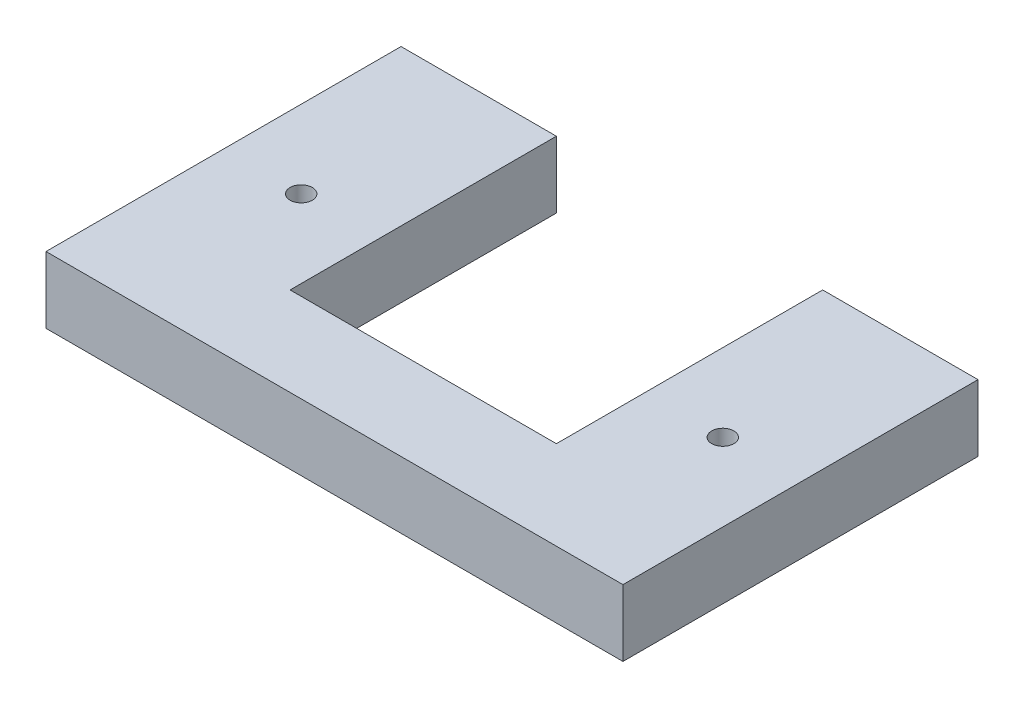
ISO-10303-21;
HEADER;
FILE_DESCRIPTION(('STEP AP214'),'2;1');
FILE_NAME('part.step','',(''),(''),'','','');
FILE_SCHEMA(('AUTOMOTIVE_DESIGN { 1 0 10303 214 1 1 1 1 }'));
ENDSEC;
DATA;
#1=APPLICATION_CONTEXT('core data for automotive mechanical design processes');
#2=APPLICATION_PROTOCOL_DEFINITION('international standard','automotive_design',2000,#1);
#3=PRODUCT_CONTEXT('',#1,'mechanical');
#4=PRODUCT('Part','Part','',(#3));
#5=PRODUCT_RELATED_PRODUCT_CATEGORY('part','',(#4));
#6=PRODUCT_DEFINITION_FORMATION('','',#4);
#7=PRODUCT_DEFINITION_CONTEXT('part definition',#1,'design');
#8=PRODUCT_DEFINITION('design','',#6,#7);
#9=PRODUCT_DEFINITION_SHAPE('','',#8);
#10=(LENGTH_UNIT() NAMED_UNIT(*) SI_UNIT(.MILLI.,.METRE.));
#11=(NAMED_UNIT(*) PLANE_ANGLE_UNIT() SI_UNIT($,.RADIAN.));
#12=(NAMED_UNIT(*) SI_UNIT($,.STERADIAN.) SOLID_ANGLE_UNIT());
#13=UNCERTAINTY_MEASURE_WITH_UNIT(LENGTH_MEASURE(1.E-05),#10,'distance_accuracy_value','');
#14=(GEOMETRIC_REPRESENTATION_CONTEXT(3) GLOBAL_UNCERTAINTY_ASSIGNED_CONTEXT((#13)) GLOBAL_UNIT_ASSIGNED_CONTEXT((#10,
#11,#12)) REPRESENTATION_CONTEXT('',''));
#15=CARTESIAN_POINT('',(0.,0.,0.));
#16=DIRECTION('',(0.,0.,1.));
#17=DIRECTION('',(1.,0.,0.));
#18=AXIS2_PLACEMENT_3D('',#15,#16,#17);
#19=CARTESIAN_POINT('',(-82.55,19.05,-50.8));
#20=DIRECTION('',(0.,0.,1.));
#21=DIRECTION('',(1.,0.,0.));
#22=AXIS2_PLACEMENT_3D('',#19,#20,#21);
#23=PLANE('',#22);
#24=DIRECTION('',(-1.,0.,0.));
#25=VECTOR('',#24,1.);
#26=CARTESIAN_POINT('',(-82.55,19.05,-50.8));
#27=LINE('',#26,#25);
#28=CARTESIAN_POINT('',(-38.1,19.05,-50.8));
#29=VERTEX_POINT('',#28);
#30=CARTESIAN_POINT('',(-82.55,19.05,-50.8));
#31=VERTEX_POINT('',#30);
#32=EDGE_CURVE('E167',#29,#31,#27,.T.);
#33=ORIENTED_EDGE('',*,*,#32,.F.);
#34=DIRECTION('',(0.,1.,0.));
#35=VECTOR('',#34,1.);
#36=CARTESIAN_POINT('',(-38.1,0.,-50.8));
#37=LINE('',#36,#35);
#38=CARTESIAN_POINT('',(-38.1,0.,-50.8));
#39=VERTEX_POINT('',#38);
#40=EDGE_CURVE('E155',#39,#29,#37,.T.);
#41=ORIENTED_EDGE('',*,*,#40,.F.);
#42=DIRECTION('',(-1.,0.,0.));
#43=VECTOR('',#42,1.);
#44=CARTESIAN_POINT('',(-82.55,0.,-50.8));
#45=LINE('',#44,#43);
#46=CARTESIAN_POINT('',(-82.55,0.,-50.8));
#47=VERTEX_POINT('',#46);
#48=EDGE_CURVE('E137',#39,#47,#45,.T.);
#49=ORIENTED_EDGE('',*,*,#48,.T.);
#50=DIRECTION('',(0.,-1.,0.));
#51=VECTOR('',#50,1.);
#52=CARTESIAN_POINT('',(-82.55,19.05,-50.8));
#53=LINE('',#52,#51);
#54=EDGE_CURVE('E48',#31,#47,#53,.T.);
#55=ORIENTED_EDGE('',*,*,#54,.F.);
#56=EDGE_LOOP('',(#33,#41,#49,#55));
#57=FACE_BOUND('',#56,.T.);
#58=ADVANCED_FACE('F39',(#57),#23,.F.);
#59=CARTESIAN_POINT('',(82.55,19.05,50.8));
#60=DIRECTION('',(-1.,0.,0.));
#61=DIRECTION('',(0.,0.,1.));
#62=AXIS2_PLACEMENT_3D('',#59,#60,#61);
#63=PLANE('',#62);
#64=DIRECTION('',(0.,0.,-1.));
#65=VECTOR('',#64,1.);
#66=CARTESIAN_POINT('',(82.55,0.,50.8));
#67=LINE('',#66,#65);
#68=CARTESIAN_POINT('',(82.55,0.,50.8));
#69=VERTEX_POINT('',#68);
#70=CARTESIAN_POINT('',(82.55,0.,-50.8));
#71=VERTEX_POINT('',#70);
#72=EDGE_CURVE('E158',#69,#71,#67,.T.);
#73=ORIENTED_EDGE('',*,*,#72,.T.);
#74=DIRECTION('',(0.,-1.,0.));
#75=VECTOR('',#74,1.);
#76=CARTESIAN_POINT('',(82.55,19.05,-50.8));
#77=LINE('',#76,#75);
#78=CARTESIAN_POINT('',(82.55,19.05,-50.8));
#79=VERTEX_POINT('',#78);
#80=EDGE_CURVE('E11',#79,#71,#77,.T.);
#81=ORIENTED_EDGE('',*,*,#80,.F.);
#82=DIRECTION('',(0.,0.,-1.));
#83=VECTOR('',#82,1.);
#84=CARTESIAN_POINT('',(82.55,19.05,50.8));
#85=LINE('',#84,#83);
#86=CARTESIAN_POINT('',(82.55,19.05,50.8));
#87=VERTEX_POINT('',#86);
#88=EDGE_CURVE('E164',#87,#79,#85,.T.);
#89=ORIENTED_EDGE('',*,*,#88,.F.);
#90=DIRECTION('',(0.,-1.,0.));
#91=VECTOR('',#90,1.);
#92=CARTESIAN_POINT('',(82.55,19.05,50.8));
#93=LINE('',#92,#91);
#94=EDGE_CURVE('E175',#87,#69,#93,.T.);
#95=ORIENTED_EDGE('',*,*,#94,.T.);
#96=EDGE_LOOP('',(#73,#81,#89,#95));
#97=FACE_BOUND('',#96,.T.);
#98=ADVANCED_FACE('F41',(#97),#63,.F.);
#99=CARTESIAN_POINT('',(38.1,0.,-50.8));
#100=VERTEX_POINT('',#99);
#101=EDGE_CURVE('E179',#71,#100,#45,.T.);
#102=ORIENTED_EDGE('',*,*,#101,.T.);
#103=DIRECTION('',(0.,1.,0.));
#104=VECTOR('',#103,1.);
#105=CARTESIAN_POINT('',(38.1,0.,-50.8));
#106=LINE('',#105,#104);
#107=CARTESIAN_POINT('',(38.1,19.05,-50.8));
#108=VERTEX_POINT('',#107);
#109=EDGE_CURVE('E159',#100,#108,#106,.T.);
#110=ORIENTED_EDGE('',*,*,#109,.T.);
#111=EDGE_CURVE('E92',#79,#108,#27,.T.);
#112=ORIENTED_EDGE('',*,*,#111,.F.);
#113=ORIENTED_EDGE('',*,*,#80,.T.);
#114=EDGE_LOOP('',(#102,#110,#112,#113));
#115=FACE_BOUND('',#114,.T.);
#116=ADVANCED_FACE('F215',(#115),#23,.F.);
#117=CARTESIAN_POINT('',(-82.55,19.05,50.8));
#118=DIRECTION('',(1.,0.,0.));
#119=DIRECTION('',(0.,0.,-1.));
#120=AXIS2_PLACEMENT_3D('',#117,#118,#119);
#121=PLANE('',#120);
#122=DIRECTION('',(0.,0.,1.));
#123=VECTOR('',#122,1.);
#124=CARTESIAN_POINT('',(-82.55,0.,50.8));
#125=LINE('',#124,#123);
#126=CARTESIAN_POINT('',(-82.55,0.,50.8));
#127=VERTEX_POINT('',#126);
#128=EDGE_CURVE('E183',#47,#127,#125,.T.);
#129=ORIENTED_EDGE('',*,*,#128,.T.);
#130=DIRECTION('',(0.,-1.,0.));
#131=VECTOR('',#130,1.);
#132=CARTESIAN_POINT('',(-82.55,19.05,50.8));
#133=LINE('',#132,#131);
#134=CARTESIAN_POINT('',(-82.55,19.05,50.8));
#135=VERTEX_POINT('',#134);
#136=EDGE_CURVE('E190',#135,#127,#133,.T.);
#137=ORIENTED_EDGE('',*,*,#136,.F.);
#138=DIRECTION('',(0.,0.,1.));
#139=VECTOR('',#138,1.);
#140=CARTESIAN_POINT('',(-82.55,19.05,50.8));
#141=LINE('',#140,#139);
#142=EDGE_CURVE('E170',#31,#135,#141,.T.);
#143=ORIENTED_EDGE('',*,*,#142,.F.);
#144=ORIENTED_EDGE('',*,*,#54,.T.);
#145=EDGE_LOOP('',(#129,#137,#143,#144));
#146=FACE_BOUND('',#145,.T.);
#147=ADVANCED_FACE('F197',(#146),#121,.F.);
#148=CARTESIAN_POINT('',(-82.55,19.05,50.8));
#149=DIRECTION('',(0.,0.,-1.));
#150=DIRECTION('',(-1.,0.,0.));
#151=AXIS2_PLACEMENT_3D('',#148,#149,#150);
#152=PLANE('',#151);
#153=DIRECTION('',(1.,0.,0.));
#154=VECTOR('',#153,1.);
#155=CARTESIAN_POINT('',(-82.55,0.,50.8));
#156=LINE('',#155,#154);
#157=EDGE_CURVE('E85',#127,#69,#156,.T.);
#158=ORIENTED_EDGE('',*,*,#157,.T.);
#159=ORIENTED_EDGE('',*,*,#94,.F.);
#160=DIRECTION('',(1.,0.,0.));
#161=VECTOR('',#160,1.);
#162=CARTESIAN_POINT('',(-82.55,19.05,50.8));
#163=LINE('',#162,#161);
#164=EDGE_CURVE('E64',#135,#87,#163,.T.);
#165=ORIENTED_EDGE('',*,*,#164,.F.);
#166=ORIENTED_EDGE('',*,*,#136,.T.);
#167=EDGE_LOOP('',(#158,#159,#165,#166));
#168=FACE_BOUND('',#167,.T.);
#169=ADVANCED_FACE('F205',(#168),#152,.F.);
#170=CARTESIAN_POINT('',(0.,19.05,0.));
#171=DIRECTION('',(0.,-1.,0.));
#172=DIRECTION('',(0.,0.,-1.));
#173=AXIS2_PLACEMENT_3D('',#170,#171,#172);
#174=PLANE('',#173);
#175=CARTESIAN_POINT('',(-60.325,19.05,0.));
#176=DIRECTION('',(0.,1.,0.));
#177=DIRECTION('',(0.,0.,1.));
#178=AXIS2_PLACEMENT_3D('',#175,#176,#177);
#179=CIRCLE('',#178,3.175);
#180=CARTESIAN_POINT('',(-60.325,19.05,3.17499999999998));
#181=VERTEX_POINT('',#180);
#182=EDGE_CURVE('E307',#181,#181,#179,.T.);
#183=ORIENTED_EDGE('',*,*,#182,.F.);
#184=EDGE_LOOP('',(#183));
#185=FACE_BOUND('',#184,.T.);
#186=CARTESIAN_POINT('',(60.325,19.05,0.));
#187=DIRECTION('',(0.,1.,0.));
#188=DIRECTION('',(0.,0.,1.));
#189=AXIS2_PLACEMENT_3D('',#186,#187,#188);
#190=CIRCLE('',#189,3.175);
#191=CARTESIAN_POINT('',(60.325,19.05,3.17499999999998));
#192=VERTEX_POINT('',#191);
#193=EDGE_CURVE('E145',#192,#192,#190,.T.);
#194=ORIENTED_EDGE('',*,*,#193,.F.);
#195=EDGE_LOOP('',(#194));
#196=FACE_BOUND('',#195,.T.);
#197=DIRECTION('',(1.,0.,0.));
#198=VECTOR('',#197,1.);
#199=CARTESIAN_POINT('',(-38.1,19.05,25.4));
#200=LINE('',#199,#198);
#201=CARTESIAN_POINT('',(-38.1,19.05,25.4));
#202=VERTEX_POINT('',#201);
#203=CARTESIAN_POINT('',(38.1,19.05,25.4));
#204=VERTEX_POINT('',#203);
#205=EDGE_CURVE('E142',#202,#204,#200,.T.);
#206=ORIENTED_EDGE('',*,*,#205,.F.);
#207=DIRECTION('',(0.,0.,1.));
#208=VECTOR('',#207,1.);
#209=CARTESIAN_POINT('',(-38.1,19.05,-50.8));
#210=LINE('',#209,#208);
#211=EDGE_CURVE('E121',#29,#202,#210,.T.);
#212=ORIENTED_EDGE('',*,*,#211,.F.);
#213=ORIENTED_EDGE('',*,*,#32,.T.);
#214=ORIENTED_EDGE('',*,*,#142,.T.);
#215=ORIENTED_EDGE('',*,*,#164,.T.);
#216=ORIENTED_EDGE('',*,*,#88,.T.);
#217=ORIENTED_EDGE('',*,*,#111,.T.);
#218=DIRECTION('',(0.,0.,-1.));
#219=VECTOR('',#218,1.);
#220=CARTESIAN_POINT('',(38.1,19.05,-50.8));
#221=LINE('',#220,#219);
#222=EDGE_CURVE('E139',#204,#108,#221,.T.);
#223=ORIENTED_EDGE('',*,*,#222,.F.);
#224=EDGE_LOOP('',(#206,#212,#213,#214,#215,#216,#217,#223));
#225=FACE_BOUND('',#224,.T.);
#226=ADVANCED_FACE('F207',(#185,#196,#225),#174,.F.);
#227=CARTESIAN_POINT('',(0.,0.,0.));
#228=DIRECTION('',(0.,-1.,0.));
#229=DIRECTION('',(0.,0.,-1.));
#230=AXIS2_PLACEMENT_3D('',#227,#228,#229);
#231=PLANE('',#230);
#232=DIRECTION('',(0.,0.,1.));
#233=VECTOR('',#232,1.);
#234=CARTESIAN_POINT('',(-38.1,0.,-50.8));
#235=LINE('',#234,#233);
#236=CARTESIAN_POINT('',(-38.1,0.,25.4));
#237=VERTEX_POINT('',#236);
#238=EDGE_CURVE('E118',#39,#237,#235,.T.);
#239=ORIENTED_EDGE('',*,*,#238,.T.);
#240=DIRECTION('',(1.,0.,0.));
#241=VECTOR('',#240,1.);
#242=CARTESIAN_POINT('',(-38.1,0.,25.4));
#243=LINE('',#242,#241);
#244=CARTESIAN_POINT('',(38.1,0.,25.4));
#245=VERTEX_POINT('',#244);
#246=EDGE_CURVE('E129',#237,#245,#243,.T.);
#247=ORIENTED_EDGE('',*,*,#246,.T.);
#248=DIRECTION('',(0.,0.,-1.));
#249=VECTOR('',#248,1.);
#250=CARTESIAN_POINT('',(38.1,0.,-50.8));
#251=LINE('',#250,#249);
#252=EDGE_CURVE('E55',#245,#100,#251,.T.);
#253=ORIENTED_EDGE('',*,*,#252,.T.);
#254=ORIENTED_EDGE('',*,*,#101,.F.);
#255=ORIENTED_EDGE('',*,*,#72,.F.);
#256=ORIENTED_EDGE('',*,*,#157,.F.);
#257=ORIENTED_EDGE('',*,*,#128,.F.);
#258=ORIENTED_EDGE('',*,*,#48,.F.);
#259=EDGE_LOOP('',(#239,#247,#253,#254,#255,#256,#257,#258));
#260=FACE_BOUND('',#259,.T.);
#261=ADVANCED_FACE('F135',(#260),#231,.T.);
#262=CARTESIAN_POINT('',(-38.1,0.,-50.8));
#263=DIRECTION('',(-1.,0.,0.));
#264=DIRECTION('',(0.,0.,1.));
#265=AXIS2_PLACEMENT_3D('',#262,#263,#264);
#266=PLANE('',#265);
#267=ORIENTED_EDGE('',*,*,#211,.T.);
#268=DIRECTION('',(0.,1.,0.));
#269=VECTOR('',#268,1.);
#270=CARTESIAN_POINT('',(-38.1,0.,25.4));
#271=LINE('',#270,#269);
#272=EDGE_CURVE('E114',#237,#202,#271,.T.);
#273=ORIENTED_EDGE('',*,*,#272,.F.);
#274=ORIENTED_EDGE('',*,*,#238,.F.);
#275=ORIENTED_EDGE('',*,*,#40,.T.);
#276=EDGE_LOOP('',(#267,#273,#274,#275));
#277=FACE_BOUND('',#276,.T.);
#278=ADVANCED_FACE('F116',(#277),#266,.F.);
#279=CARTESIAN_POINT('',(38.1,0.,-50.8));
#280=DIRECTION('',(1.,0.,0.));
#281=DIRECTION('',(0.,0.,-1.));
#282=AXIS2_PLACEMENT_3D('',#279,#280,#281);
#283=PLANE('',#282);
#284=ORIENTED_EDGE('',*,*,#222,.T.);
#285=ORIENTED_EDGE('',*,*,#109,.F.);
#286=ORIENTED_EDGE('',*,*,#252,.F.);
#287=DIRECTION('',(0.,1.,0.));
#288=VECTOR('',#287,1.);
#289=CARTESIAN_POINT('',(38.1,0.,25.4));
#290=LINE('',#289,#288);
#291=EDGE_CURVE('E126',#245,#204,#290,.T.);
#292=ORIENTED_EDGE('',*,*,#291,.T.);
#293=EDGE_LOOP('',(#284,#285,#286,#292));
#294=FACE_BOUND('',#293,.T.);
#295=ADVANCED_FACE('F226',(#294),#283,.F.);
#296=CARTESIAN_POINT('',(-38.1,0.,25.4));
#297=DIRECTION('',(0.,0.,1.));
#298=DIRECTION('',(1.,0.,0.));
#299=AXIS2_PLACEMENT_3D('',#296,#297,#298);
#300=PLANE('',#299);
#301=ORIENTED_EDGE('',*,*,#205,.T.);
#302=ORIENTED_EDGE('',*,*,#291,.F.);
#303=ORIENTED_EDGE('',*,*,#246,.F.);
#304=ORIENTED_EDGE('',*,*,#272,.T.);
#305=EDGE_LOOP('',(#301,#302,#303,#304));
#306=FACE_BOUND('',#305,.T.);
#307=ADVANCED_FACE('F130',(#306),#300,.F.);
#308=CARTESIAN_POINT('',(60.325,3.175,0.));
#309=DIRECTION('',(0.,1.,0.));
#310=DIRECTION('',(0.,0.,1.));
#311=AXIS2_PLACEMENT_3D('',#308,#309,#310);
#312=CYLINDRICAL_SURFACE('',#311,3.175);
#313=CARTESIAN_POINT('',(60.325,3.175,0.));
#314=DIRECTION('',(0.,1.,0.));
#315=DIRECTION('',(0.,0.,1.));
#316=AXIS2_PLACEMENT_3D('',#313,#314,#315);
#317=CIRCLE('',#316,3.175);
#318=CARTESIAN_POINT('',(60.325,3.175,3.17499999999998));
#319=VERTEX_POINT('',#318);
#320=EDGE_CURVE('E311',#319,#319,#317,.T.);
#321=ORIENTED_EDGE('',*,*,#320,.F.);
#322=EDGE_LOOP('',(#321));
#323=FACE_BOUND('',#322,.T.);
#324=ORIENTED_EDGE('',*,*,#193,.T.);
#325=EDGE_LOOP('',(#324));
#326=FACE_BOUND('',#325,.T.);
#327=ADVANCED_FACE('F233',(#323,#326),#312,.F.);
#328=CARTESIAN_POINT('',(60.325,3.175,0.));
#329=DIRECTION('',(0.,1.,0.));
#330=DIRECTION('',(0.,0.,1.));
#331=AXIS2_PLACEMENT_3D('',#328,#329,#330);
#332=PLANE('',#331);
#333=ORIENTED_EDGE('',*,*,#320,.T.);
#334=EDGE_LOOP('',(#333));
#335=FACE_BOUND('',#334,.T.);
#336=ADVANCED_FACE('F272',(#335),#332,.T.);
#337=CARTESIAN_POINT('',(-60.325,3.175,0.));
#338=DIRECTION('',(0.,1.,0.));
#339=DIRECTION('',(0.,0.,1.));
#340=AXIS2_PLACEMENT_3D('',#337,#338,#339);
#341=CYLINDRICAL_SURFACE('',#340,3.175);
#342=CARTESIAN_POINT('',(-60.325,3.175,0.));
#343=DIRECTION('',(0.,1.,0.));
#344=DIRECTION('',(0.,0.,1.));
#345=AXIS2_PLACEMENT_3D('',#342,#343,#344);
#346=CIRCLE('',#345,3.175);
#347=CARTESIAN_POINT('',(-60.325,3.175,3.17499999999998));
#348=VERTEX_POINT('',#347);
#349=EDGE_CURVE('E152',#348,#348,#346,.T.);
#350=ORIENTED_EDGE('',*,*,#349,.F.);
#351=EDGE_LOOP('',(#350));
#352=FACE_BOUND('',#351,.T.);
#353=ORIENTED_EDGE('',*,*,#182,.T.);
#354=EDGE_LOOP('',(#353));
#355=FACE_BOUND('',#354,.T.);
#356=ADVANCED_FACE('F281',(#352,#355),#341,.F.);
#357=CARTESIAN_POINT('',(-60.325,3.175,0.));
#358=DIRECTION('',(0.,1.,0.));
#359=DIRECTION('',(0.,0.,1.));
#360=AXIS2_PLACEMENT_3D('',#357,#358,#359);
#361=PLANE('',#360);
#362=ORIENTED_EDGE('',*,*,#349,.T.);
#363=EDGE_LOOP('',(#362));
#364=FACE_BOUND('',#363,.T.);
#365=ADVANCED_FACE('F290',(#364),#361,.T.);
#366=CLOSED_SHELL('',(#58,#98,#116,#147,#169,#226,#261,#278,#295,#307,#327,#336,#356,#365));
#367=MANIFOLD_SOLID_BREP('B2',#366);
#368=ADVANCED_BREP_SHAPE_REPRESENTATION('',(#18,#367),#14);
#369=SHAPE_DEFINITION_REPRESENTATION(#9,#368);
ENDSEC;
END-ISO-10303-21;
